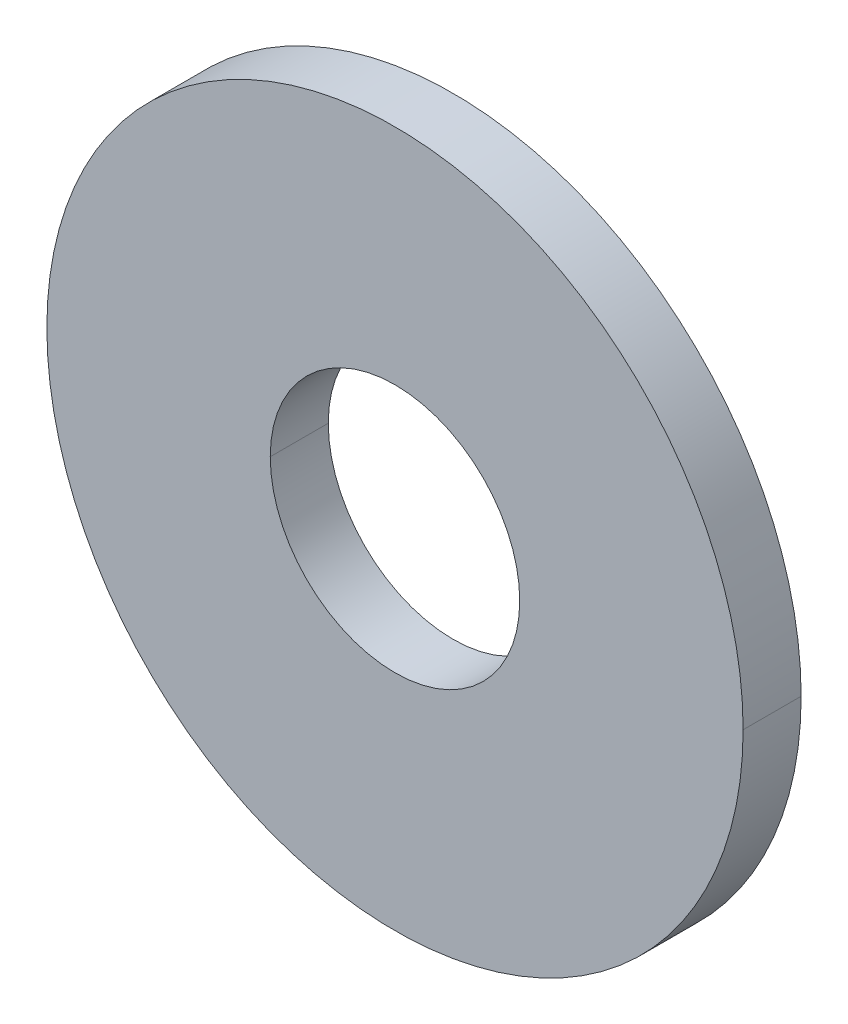
ISO-10303-21;
HEADER;
FILE_DESCRIPTION(('STEP AP214'),'2;1');
FILE_NAME('part.step','',(''),(''),'','','');
FILE_SCHEMA(('AUTOMOTIVE_DESIGN { 1 0 10303 214 1 1 1 1 }'));
ENDSEC;
DATA;
#1=APPLICATION_CONTEXT('core data for automotive mechanical design processes');
#2=APPLICATION_PROTOCOL_DEFINITION('international standard','automotive_design',2000,#1);
#3=PRODUCT_CONTEXT('',#1,'mechanical');
#4=PRODUCT('Part','Part','',(#3));
#5=PRODUCT_RELATED_PRODUCT_CATEGORY('part','',(#4));
#6=PRODUCT_DEFINITION_FORMATION('','',#4);
#7=PRODUCT_DEFINITION_CONTEXT('part definition',#1,'design');
#8=PRODUCT_DEFINITION('design','',#6,#7);
#9=PRODUCT_DEFINITION_SHAPE('','',#8);
#10=(LENGTH_UNIT() NAMED_UNIT(*) SI_UNIT(.MILLI.,.METRE.));
#11=(NAMED_UNIT(*) PLANE_ANGLE_UNIT() SI_UNIT($,.RADIAN.));
#12=(NAMED_UNIT(*) SI_UNIT($,.STERADIAN.) SOLID_ANGLE_UNIT());
#13=UNCERTAINTY_MEASURE_WITH_UNIT(LENGTH_MEASURE(1.E-05),#10,'distance_accuracy_value','');
#14=(GEOMETRIC_REPRESENTATION_CONTEXT(3) GLOBAL_UNCERTAINTY_ASSIGNED_CONTEXT((#13)) GLOBAL_UNIT_ASSIGNED_CONTEXT((#10,
#11,#12)) REPRESENTATION_CONTEXT('',''));
#15=CARTESIAN_POINT('',(0.,0.,0.));
#16=DIRECTION('',(0.,0.,1.));
#17=DIRECTION('',(1.,0.,0.));
#18=AXIS2_PLACEMENT_3D('',#15,#16,#17);
#19=CARTESIAN_POINT('',(0.,0.,1.));
#20=DIRECTION('',(0.,0.,-1.));
#21=DIRECTION('',(-1.,0.,0.));
#22=AXIS2_PLACEMENT_3D('',#19,#20,#21);
#23=CYLINDRICAL_SURFACE('',#22,2.15);
#24=DIRECTION('',(0.,0.,-1.));
#25=VECTOR('',#24,1.);
#26=CARTESIAN_POINT('',(2.15,0.,1.));
#27=LINE('',#26,#25);
#28=CARTESIAN_POINT('',(2.15,0.,1.));
#29=VERTEX_POINT('',#28);
#30=CARTESIAN_POINT('',(2.15,0.,0.));
#31=VERTEX_POINT('',#30);
#32=EDGE_CURVE('E70',#29,#31,#27,.T.);
#33=ORIENTED_EDGE('',*,*,#32,.F.);
#34=CARTESIAN_POINT('',(0.,0.,1.));
#35=DIRECTION('',(0.,0.,1.));
#36=DIRECTION('',(1.,0.,0.));
#37=AXIS2_PLACEMENT_3D('',#34,#35,#36);
#38=CIRCLE('',#37,2.15);
#39=CARTESIAN_POINT('',(-2.15,0.,1.));
#40=VERTEX_POINT('',#39);
#41=EDGE_CURVE('E65',#29,#40,#38,.T.);
#42=ORIENTED_EDGE('',*,*,#41,.T.);
#43=DIRECTION('',(0.,0.,-1.));
#44=VECTOR('',#43,1.);
#45=CARTESIAN_POINT('',(-2.15,0.,1.));
#46=LINE('',#45,#44);
#47=CARTESIAN_POINT('',(-2.15,0.,0.));
#48=VERTEX_POINT('',#47);
#49=EDGE_CURVE('E67',#40,#48,#46,.T.);
#50=ORIENTED_EDGE('',*,*,#49,.T.);
#51=CARTESIAN_POINT('',(0.,0.,0.));
#52=DIRECTION('',(0.,0.,1.));
#53=DIRECTION('',(1.,0.,0.));
#54=AXIS2_PLACEMENT_3D('',#51,#52,#53);
#55=CIRCLE('',#54,2.15);
#56=EDGE_CURVE('E9',#31,#48,#55,.T.);
#57=ORIENTED_EDGE('',*,*,#56,.F.);
#58=EDGE_LOOP('',(#33,#42,#50,#57));
#59=FACE_BOUND('',#58,.T.);
#60=ADVANCED_FACE('F15',(#59),#23,.F.);
#61=CARTESIAN_POINT('',(0.,0.,1.));
#62=DIRECTION('',(0.,0.,-1.));
#63=DIRECTION('',(-1.,0.,0.));
#64=AXIS2_PLACEMENT_3D('',#61,#62,#63);
#65=CYLINDRICAL_SURFACE('',#64,6.);
#66=DIRECTION('',(0.,0.,-1.));
#67=VECTOR('',#66,1.);
#68=CARTESIAN_POINT('',(6.,0.,1.));
#69=LINE('',#68,#67);
#70=CARTESIAN_POINT('',(6.,0.,1.));
#71=VERTEX_POINT('',#70);
#72=CARTESIAN_POINT('',(6.,0.,0.));
#73=VERTEX_POINT('',#72);
#74=EDGE_CURVE('E96',#71,#73,#69,.T.);
#75=ORIENTED_EDGE('',*,*,#74,.F.);
#76=CARTESIAN_POINT('',(0.,0.,1.));
#77=DIRECTION('',(0.,0.,1.));
#78=DIRECTION('',(1.,0.,0.));
#79=AXIS2_PLACEMENT_3D('',#76,#77,#78);
#80=CIRCLE('',#79,6.);
#81=CARTESIAN_POINT('',(-6.,0.,1.));
#82=VERTEX_POINT('',#81);
#83=EDGE_CURVE('E75',#82,#71,#80,.T.);
#84=ORIENTED_EDGE('',*,*,#83,.F.);
#85=DIRECTION('',(0.,0.,-1.));
#86=VECTOR('',#85,1.);
#87=CARTESIAN_POINT('',(-6.,0.,1.));
#88=LINE('',#87,#86);
#89=CARTESIAN_POINT('',(-6.,0.,0.));
#90=VERTEX_POINT('',#89);
#91=EDGE_CURVE('E19',#82,#90,#88,.T.);
#92=ORIENTED_EDGE('',*,*,#91,.T.);
#93=CARTESIAN_POINT('',(0.,0.,0.));
#94=DIRECTION('',(0.,0.,1.));
#95=DIRECTION('',(1.,0.,0.));
#96=AXIS2_PLACEMENT_3D('',#93,#94,#95);
#97=CIRCLE('',#96,6.);
#98=EDGE_CURVE('E26',#90,#73,#97,.T.);
#99=ORIENTED_EDGE('',*,*,#98,.T.);
#100=EDGE_LOOP('',(#75,#84,#92,#99));
#101=FACE_BOUND('',#100,.T.);
#102=ADVANCED_FACE('F120',(#101),#65,.T.);
#103=CARTESIAN_POINT('',(0.,0.,0.));
#104=DIRECTION('',(0.,0.,1.));
#105=DIRECTION('',(1.,0.,0.));
#106=AXIS2_PLACEMENT_3D('',#103,#104,#105);
#107=PLANE('',#106);
#108=CARTESIAN_POINT('',(0.,0.,0.));
#109=DIRECTION('',(0.,0.,1.));
#110=DIRECTION('',(1.,0.,0.));
#111=AXIS2_PLACEMENT_3D('',#108,#109,#110);
#112=CIRCLE('',#111,2.15);
#113=EDGE_CURVE('E81',#48,#31,#112,.T.);
#114=ORIENTED_EDGE('',*,*,#113,.T.);
#115=ORIENTED_EDGE('',*,*,#56,.T.);
#116=EDGE_LOOP('',(#114,#115));
#117=FACE_BOUND('',#116,.T.);
#118=ORIENTED_EDGE('',*,*,#98,.F.);
#119=CARTESIAN_POINT('',(0.,0.,0.));
#120=DIRECTION('',(0.,0.,1.));
#121=DIRECTION('',(1.,0.,0.));
#122=AXIS2_PLACEMENT_3D('',#119,#120,#121);
#123=CIRCLE('',#122,6.);
#124=EDGE_CURVE('E104',#73,#90,#123,.T.);
#125=ORIENTED_EDGE('',*,*,#124,.F.);
#126=EDGE_LOOP('',(#118,#125));
#127=FACE_BOUND('',#126,.T.);
#128=ADVANCED_FACE('F121',(#117,#127),#107,.F.);
#129=CARTESIAN_POINT('',(0.,0.,1.));
#130=DIRECTION('',(0.,0.,1.));
#131=DIRECTION('',(1.,0.,0.));
#132=AXIS2_PLACEMENT_3D('',#129,#130,#131);
#133=PLANE('',#132);
#134=CARTESIAN_POINT('',(0.,0.,1.));
#135=DIRECTION('',(0.,0.,1.));
#136=DIRECTION('',(1.,0.,0.));
#137=AXIS2_PLACEMENT_3D('',#134,#135,#136);
#138=CIRCLE('',#137,2.15);
#139=EDGE_CURVE('E79',#40,#29,#138,.T.);
#140=ORIENTED_EDGE('',*,*,#139,.F.);
#141=ORIENTED_EDGE('',*,*,#41,.F.);
#142=EDGE_LOOP('',(#140,#141));
#143=FACE_BOUND('',#142,.T.);
#144=ORIENTED_EDGE('',*,*,#83,.T.);
#145=CARTESIAN_POINT('',(0.,0.,1.));
#146=DIRECTION('',(0.,0.,1.));
#147=DIRECTION('',(1.,0.,0.));
#148=AXIS2_PLACEMENT_3D('',#145,#146,#147);
#149=CIRCLE('',#148,6.);
#150=EDGE_CURVE('E83',#71,#82,#149,.T.);
#151=ORIENTED_EDGE('',*,*,#150,.T.);
#152=EDGE_LOOP('',(#144,#151));
#153=FACE_BOUND('',#152,.T.);
#154=ADVANCED_FACE('F85',(#143,#153),#133,.T.);
#155=CARTESIAN_POINT('',(0.,0.,1.));
#156=DIRECTION('',(0.,0.,-1.));
#157=DIRECTION('',(-1.,0.,0.));
#158=AXIS2_PLACEMENT_3D('',#155,#156,#157);
#159=CYLINDRICAL_SURFACE('',#158,6.);
#160=ORIENTED_EDGE('',*,*,#150,.F.);
#161=ORIENTED_EDGE('',*,*,#74,.T.);
#162=ORIENTED_EDGE('',*,*,#124,.T.);
#163=ORIENTED_EDGE('',*,*,#91,.F.);
#164=EDGE_LOOP('',(#160,#161,#162,#163));
#165=FACE_BOUND('',#164,.T.);
#166=ADVANCED_FACE('F17',(#165),#159,.T.);
#167=CARTESIAN_POINT('',(0.,0.,1.));
#168=DIRECTION('',(0.,0.,-1.));
#169=DIRECTION('',(-1.,0.,0.));
#170=AXIS2_PLACEMENT_3D('',#167,#168,#169);
#171=CYLINDRICAL_SURFACE('',#170,2.15);
#172=ORIENTED_EDGE('',*,*,#139,.T.);
#173=ORIENTED_EDGE('',*,*,#32,.T.);
#174=ORIENTED_EDGE('',*,*,#113,.F.);
#175=ORIENTED_EDGE('',*,*,#49,.F.);
#176=EDGE_LOOP('',(#172,#173,#174,#175));
#177=FACE_BOUND('',#176,.T.);
#178=ADVANCED_FACE('F78',(#177),#171,.F.);
#179=CLOSED_SHELL('',(#60,#102,#128,#154,#166,#178));
#180=MANIFOLD_SOLID_BREP('B1',#179);
#181=ADVANCED_BREP_SHAPE_REPRESENTATION('',(#18,#180),#14);
#182=SHAPE_DEFINITION_REPRESENTATION(#9,#181);
ENDSEC;
END-ISO-10303-21;
